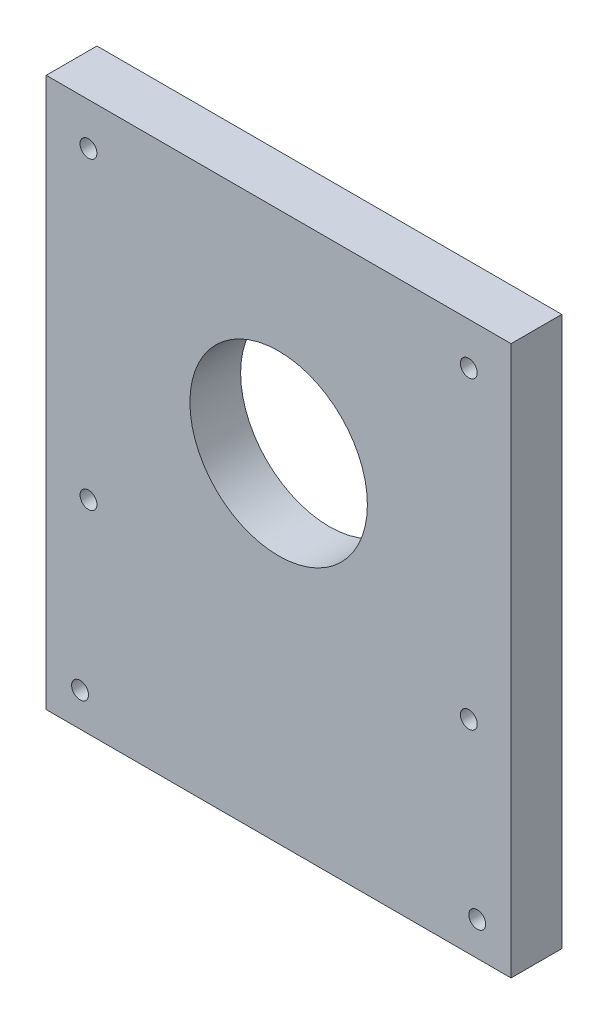
ISO-10303-21;
HEADER;
FILE_DESCRIPTION(('STEP AP214'),'2;1');
FILE_NAME('part.step','',(''),(''),'','','');
FILE_SCHEMA(('AUTOMOTIVE_DESIGN { 1 0 10303 214 1 1 1 1 }'));
ENDSEC;
DATA;
#1=APPLICATION_CONTEXT('core data for automotive mechanical design processes');
#2=APPLICATION_PROTOCOL_DEFINITION('international standard','automotive_design',2000,#1);
#3=PRODUCT_CONTEXT('',#1,'mechanical');
#4=PRODUCT('Part','Part','',(#3));
#5=PRODUCT_RELATED_PRODUCT_CATEGORY('part','',(#4));
#6=PRODUCT_DEFINITION_FORMATION('','',#4);
#7=PRODUCT_DEFINITION_CONTEXT('part definition',#1,'design');
#8=PRODUCT_DEFINITION('design','',#6,#7);
#9=PRODUCT_DEFINITION_SHAPE('','',#8);
#10=(LENGTH_UNIT() NAMED_UNIT(*) SI_UNIT(.MILLI.,.METRE.));
#11=(NAMED_UNIT(*) PLANE_ANGLE_UNIT() SI_UNIT($,.RADIAN.));
#12=(NAMED_UNIT(*) SI_UNIT($,.STERADIAN.) SOLID_ANGLE_UNIT());
#13=UNCERTAINTY_MEASURE_WITH_UNIT(LENGTH_MEASURE(1.E-05),#10,'distance_accuracy_value','');
#14=(GEOMETRIC_REPRESENTATION_CONTEXT(3) GLOBAL_UNCERTAINTY_ASSIGNED_CONTEXT((#13)) GLOBAL_UNIT_ASSIGNED_CONTEXT((#10,
#11,#12)) REPRESENTATION_CONTEXT('',''));
#15=CARTESIAN_POINT('',(0.,0.,0.));
#16=DIRECTION('',(0.,0.,1.));
#17=DIRECTION('',(1.,0.,0.));
#18=AXIS2_PLACEMENT_3D('',#15,#16,#17);
#19=CARTESIAN_POINT('',(55.,-65.,12.));
#20=DIRECTION('',(-1.,0.,0.));
#21=DIRECTION('',(0.,0.,1.));
#22=AXIS2_PLACEMENT_3D('',#19,#20,#21);
#23=PLANE('',#22);
#24=DIRECTION('',(0.,1.,0.));
#25=VECTOR('',#24,1.);
#26=CARTESIAN_POINT('',(55.,-65.,0.));
#27=LINE('',#26,#25);
#28=CARTESIAN_POINT('',(55.,-65.,0.));
#29=VERTEX_POINT('',#28);
#30=CARTESIAN_POINT('',(55.,65.,0.));
#31=VERTEX_POINT('',#30);
#32=EDGE_CURVE('E104',#29,#31,#27,.T.);
#33=ORIENTED_EDGE('',*,*,#32,.T.);
#34=DIRECTION('',(0.,0.,-1.));
#35=VECTOR('',#34,1.);
#36=CARTESIAN_POINT('',(55.,65.,12.));
#37=LINE('',#36,#35);
#38=CARTESIAN_POINT('',(55.,65.,12.));
#39=VERTEX_POINT('',#38);
#40=EDGE_CURVE('E11',#39,#31,#37,.T.);
#41=ORIENTED_EDGE('',*,*,#40,.F.);
#42=DIRECTION('',(0.,1.,0.));
#43=VECTOR('',#42,1.);
#44=CARTESIAN_POINT('',(55.,-65.,12.));
#45=LINE('',#44,#43);
#46=CARTESIAN_POINT('',(55.,-65.,12.));
#47=VERTEX_POINT('',#46);
#48=EDGE_CURVE('E91',#47,#39,#45,.T.);
#49=ORIENTED_EDGE('',*,*,#48,.F.);
#50=DIRECTION('',(0.,0.,-1.));
#51=VECTOR('',#50,1.);
#52=CARTESIAN_POINT('',(55.,-65.,12.));
#53=LINE('',#52,#51);
#54=EDGE_CURVE('E100',#47,#29,#53,.T.);
#55=ORIENTED_EDGE('',*,*,#54,.T.);
#56=EDGE_LOOP('',(#33,#41,#49,#55));
#57=FACE_BOUND('',#56,.T.);
#58=ADVANCED_FACE('F38',(#57),#23,.F.);
#59=CARTESIAN_POINT('',(-55.,65.,12.));
#60=DIRECTION('',(0.,-1.,0.));
#61=DIRECTION('',(0.,0.,-1.));
#62=AXIS2_PLACEMENT_3D('',#59,#60,#61);
#63=PLANE('',#62);
#64=DIRECTION('',(-1.,0.,0.));
#65=VECTOR('',#64,1.);
#66=CARTESIAN_POINT('',(-55.,65.,0.));
#67=LINE('',#66,#65);
#68=CARTESIAN_POINT('',(-55.,65.,0.));
#69=VERTEX_POINT('',#68);
#70=EDGE_CURVE('E95',#31,#69,#67,.T.);
#71=ORIENTED_EDGE('',*,*,#70,.T.);
#72=DIRECTION('',(0.,0.,-1.));
#73=VECTOR('',#72,1.);
#74=CARTESIAN_POINT('',(-55.,65.,12.));
#75=LINE('',#74,#73);
#76=CARTESIAN_POINT('',(-55.,65.,12.));
#77=VERTEX_POINT('',#76);
#78=EDGE_CURVE('E47',#77,#69,#75,.T.);
#79=ORIENTED_EDGE('',*,*,#78,.F.);
#80=DIRECTION('',(-1.,0.,0.));
#81=VECTOR('',#80,1.);
#82=CARTESIAN_POINT('',(-55.,65.,12.));
#83=LINE('',#82,#81);
#84=EDGE_CURVE('E86',#39,#77,#83,.T.);
#85=ORIENTED_EDGE('',*,*,#84,.F.);
#86=ORIENTED_EDGE('',*,*,#40,.T.);
#87=EDGE_LOOP('',(#71,#79,#85,#86));
#88=FACE_BOUND('',#87,.T.);
#89=ADVANCED_FACE('F94',(#88),#63,.F.);
#90=CARTESIAN_POINT('',(-55.,-65.,12.));
#91=DIRECTION('',(1.,0.,0.));
#92=DIRECTION('',(0.,0.,-1.));
#93=AXIS2_PLACEMENT_3D('',#90,#91,#92);
#94=PLANE('',#93);
#95=DIRECTION('',(0.,-1.,0.));
#96=VECTOR('',#95,1.);
#97=CARTESIAN_POINT('',(-55.,-65.,0.));
#98=LINE('',#97,#96);
#99=CARTESIAN_POINT('',(-55.,-65.,0.));
#100=VERTEX_POINT('',#99);
#101=EDGE_CURVE('E73',#69,#100,#98,.T.);
#102=ORIENTED_EDGE('',*,*,#101,.T.);
#103=DIRECTION('',(0.,0.,-1.));
#104=VECTOR('',#103,1.);
#105=CARTESIAN_POINT('',(-55.,-65.,12.));
#106=LINE('',#105,#104);
#107=CARTESIAN_POINT('',(-55.,-65.,12.));
#108=VERTEX_POINT('',#107);
#109=EDGE_CURVE('E96',#108,#100,#106,.T.);
#110=ORIENTED_EDGE('',*,*,#109,.F.);
#111=DIRECTION('',(0.,-1.,0.));
#112=VECTOR('',#111,1.);
#113=CARTESIAN_POINT('',(-55.,-65.,12.));
#114=LINE('',#113,#112);
#115=EDGE_CURVE('E89',#77,#108,#114,.T.);
#116=ORIENTED_EDGE('',*,*,#115,.F.);
#117=ORIENTED_EDGE('',*,*,#78,.T.);
#118=EDGE_LOOP('',(#102,#110,#116,#117));
#119=FACE_BOUND('',#118,.T.);
#120=ADVANCED_FACE('F98',(#119),#94,.F.);
#121=CARTESIAN_POINT('',(-55.,-65.,12.));
#122=DIRECTION('',(0.,1.,0.));
#123=DIRECTION('',(0.,0.,1.));
#124=AXIS2_PLACEMENT_3D('',#121,#122,#123);
#125=PLANE('',#124);
#126=DIRECTION('',(1.,0.,0.));
#127=VECTOR('',#126,1.);
#128=CARTESIAN_POINT('',(-55.,-65.,0.));
#129=LINE('',#128,#127);
#130=EDGE_CURVE('E79',#100,#29,#129,.T.);
#131=ORIENTED_EDGE('',*,*,#130,.T.);
#132=ORIENTED_EDGE('',*,*,#54,.F.);
#133=DIRECTION('',(1.,0.,0.));
#134=VECTOR('',#133,1.);
#135=CARTESIAN_POINT('',(-55.,-65.,12.));
#136=LINE('',#135,#134);
#137=EDGE_CURVE('E56',#108,#47,#136,.T.);
#138=ORIENTED_EDGE('',*,*,#137,.F.);
#139=ORIENTED_EDGE('',*,*,#109,.T.);
#140=EDGE_LOOP('',(#131,#132,#138,#139));
#141=FACE_BOUND('',#140,.T.);
#142=ADVANCED_FACE('F151',(#141),#125,.F.);
#143=CARTESIAN_POINT('',(0.,0.,12.));
#144=DIRECTION('',(0.,0.,-1.));
#145=DIRECTION('',(-1.,0.,0.));
#146=AXIS2_PLACEMENT_3D('',#143,#144,#145);
#147=PLANE('',#146);
#148=CARTESIAN_POINT('',(0.,15.,12.));
#149=DIRECTION('',(0.,0.,1.));
#150=DIRECTION('',(1.,0.,0.));
#151=AXIS2_PLACEMENT_3D('',#148,#149,#150);
#152=CIRCLE('',#151,21.);
#153=CARTESIAN_POINT('',(21.,15.,12.));
#154=VERTEX_POINT('',#153);
#155=EDGE_CURVE('E295',#154,#154,#152,.T.);
#156=ORIENTED_EDGE('',*,*,#155,.F.);
#157=EDGE_LOOP('',(#156));
#158=FACE_BOUND('',#157,.T.);
#159=CARTESIAN_POINT('',(-45.,55.,12.));
#160=DIRECTION('',(0.,0.,-1.));
#161=DIRECTION('',(1.,0.,0.));
#162=AXIS2_PLACEMENT_3D('',#159,#160,#161);
#163=CIRCLE('',#162,2.);
#164=CARTESIAN_POINT('',(-43.,55.,12.));
#165=VERTEX_POINT('',#164);
#166=EDGE_CURVE('E297',#165,#165,#163,.T.);
#167=ORIENTED_EDGE('',*,*,#166,.T.);
#168=EDGE_LOOP('',(#167));
#169=FACE_BOUND('',#168,.T.);
#170=CARTESIAN_POINT('',(-45.,-17.,12.));
#171=DIRECTION('',(0.,0.,-1.));
#172=DIRECTION('',(1.,0.,0.));
#173=AXIS2_PLACEMENT_3D('',#170,#171,#172);
#174=CIRCLE('',#173,2.);
#175=CARTESIAN_POINT('',(-43.,-17.,12.));
#176=VERTEX_POINT('',#175);
#177=EDGE_CURVE('E309',#176,#176,#174,.T.);
#178=ORIENTED_EDGE('',*,*,#177,.T.);
#179=EDGE_LOOP('',(#178));
#180=FACE_BOUND('',#179,.T.);
#181=CARTESIAN_POINT('',(-47.,-57.,12.));
#182=DIRECTION('',(0.,0.,-1.));
#183=DIRECTION('',(1.,0.,0.));
#184=AXIS2_PLACEMENT_3D('',#181,#182,#183);
#185=CIRCLE('',#184,2.);
#186=CARTESIAN_POINT('',(-45.,-57.,12.));
#187=VERTEX_POINT('',#186);
#188=EDGE_CURVE('E306',#187,#187,#185,.T.);
#189=ORIENTED_EDGE('',*,*,#188,.T.);
#190=EDGE_LOOP('',(#189));
#191=FACE_BOUND('',#190,.T.);
#192=CARTESIAN_POINT('',(47.,-57.,12.));
#193=DIRECTION('',(0.,0.,-1.));
#194=DIRECTION('',(-1.,0.,0.));
#195=AXIS2_PLACEMENT_3D('',#192,#193,#194);
#196=CIRCLE('',#195,2.);
#197=CARTESIAN_POINT('',(45.,-57.,12.));
#198=VERTEX_POINT('',#197);
#199=EDGE_CURVE('E303',#198,#198,#196,.T.);
#200=ORIENTED_EDGE('',*,*,#199,.T.);
#201=EDGE_LOOP('',(#200));
#202=FACE_BOUND('',#201,.T.);
#203=CARTESIAN_POINT('',(45.,-17.,12.));
#204=DIRECTION('',(0.,0.,-1.));
#205=DIRECTION('',(-1.,0.,0.));
#206=AXIS2_PLACEMENT_3D('',#203,#204,#205);
#207=CIRCLE('',#206,2.);
#208=CARTESIAN_POINT('',(43.,-17.,12.));
#209=VERTEX_POINT('',#208);
#210=EDGE_CURVE('E300',#209,#209,#207,.T.);
#211=ORIENTED_EDGE('',*,*,#210,.T.);
#212=EDGE_LOOP('',(#211));
#213=FACE_BOUND('',#212,.T.);
#214=CARTESIAN_POINT('',(45.,55.,12.));
#215=DIRECTION('',(0.,0.,-1.));
#216=DIRECTION('',(-1.,0.,0.));
#217=AXIS2_PLACEMENT_3D('',#214,#215,#216);
#218=CIRCLE('',#217,2.);
#219=CARTESIAN_POINT('',(43.,55.,12.));
#220=VERTEX_POINT('',#219);
#221=EDGE_CURVE('E116',#220,#220,#218,.T.);
#222=ORIENTED_EDGE('',*,*,#221,.T.);
#223=EDGE_LOOP('',(#222));
#224=FACE_BOUND('',#223,.T.);
#225=ORIENTED_EDGE('',*,*,#48,.T.);
#226=ORIENTED_EDGE('',*,*,#84,.T.);
#227=ORIENTED_EDGE('',*,*,#115,.T.);
#228=ORIENTED_EDGE('',*,*,#137,.T.);
#229=EDGE_LOOP('',(#225,#226,#227,#228));
#230=FACE_BOUND('',#229,.T.);
#231=ADVANCED_FACE('F87',(#158,#169,#180,#191,#202,#213,#224,#230),#147,.F.);
#232=CARTESIAN_POINT('',(0.,0.,0.));
#233=DIRECTION('',(0.,0.,-1.));
#234=DIRECTION('',(-1.,0.,0.));
#235=AXIS2_PLACEMENT_3D('',#232,#233,#234);
#236=PLANE('',#235);
#237=CARTESIAN_POINT('',(0.,15.,0.));
#238=DIRECTION('',(0.,0.,1.));
#239=DIRECTION('',(1.,0.,0.));
#240=AXIS2_PLACEMENT_3D('',#237,#238,#239);
#241=CIRCLE('',#240,21.);
#242=CARTESIAN_POINT('',(21.,15.,0.));
#243=VERTEX_POINT('',#242);
#244=EDGE_CURVE('E292',#243,#243,#241,.T.);
#245=ORIENTED_EDGE('',*,*,#244,.T.);
#246=EDGE_LOOP('',(#245));
#247=FACE_BOUND('',#246,.T.);
#248=CARTESIAN_POINT('',(-45.,55.,0.));
#249=DIRECTION('',(0.,0.,-1.));
#250=DIRECTION('',(-1.,0.,0.));
#251=AXIS2_PLACEMENT_3D('',#248,#249,#250);
#252=CIRCLE('',#251,2.);
#253=CARTESIAN_POINT('',(-47.,55.,0.));
#254=VERTEX_POINT('',#253);
#255=EDGE_CURVE('E41',#254,#254,#252,.T.);
#256=ORIENTED_EDGE('',*,*,#255,.F.);
#257=EDGE_LOOP('',(#256));
#258=FACE_BOUND('',#257,.T.);
#259=CARTESIAN_POINT('',(-45.,-17.,0.));
#260=DIRECTION('',(0.,0.,-1.));
#261=DIRECTION('',(-1.,0.,0.));
#262=AXIS2_PLACEMENT_3D('',#259,#260,#261);
#263=CIRCLE('',#262,2.);
#264=CARTESIAN_POINT('',(-47.,-17.,0.));
#265=VERTEX_POINT('',#264);
#266=EDGE_CURVE('E124',#265,#265,#263,.T.);
#267=ORIENTED_EDGE('',*,*,#266,.F.);
#268=EDGE_LOOP('',(#267));
#269=FACE_BOUND('',#268,.T.);
#270=CARTESIAN_POINT('',(-47.,-57.,0.));
#271=DIRECTION('',(0.,0.,-1.));
#272=DIRECTION('',(-1.,0.,0.));
#273=AXIS2_PLACEMENT_3D('',#270,#271,#272);
#274=CIRCLE('',#273,2.);
#275=CARTESIAN_POINT('',(-49.,-57.,0.));
#276=VERTEX_POINT('',#275);
#277=EDGE_CURVE('E122',#276,#276,#274,.T.);
#278=ORIENTED_EDGE('',*,*,#277,.F.);
#279=EDGE_LOOP('',(#278));
#280=FACE_BOUND('',#279,.T.);
#281=CARTESIAN_POINT('',(47.,-57.,0.));
#282=DIRECTION('',(0.,0.,-1.));
#283=DIRECTION('',(-1.,0.,0.));
#284=AXIS2_PLACEMENT_3D('',#281,#282,#283);
#285=CIRCLE('',#284,2.);
#286=CARTESIAN_POINT('',(45.,-57.,0.));
#287=VERTEX_POINT('',#286);
#288=EDGE_CURVE('E119',#287,#287,#285,.T.);
#289=ORIENTED_EDGE('',*,*,#288,.F.);
#290=EDGE_LOOP('',(#289));
#291=FACE_BOUND('',#290,.T.);
#292=CARTESIAN_POINT('',(45.,-17.,0.));
#293=DIRECTION('',(0.,0.,-1.));
#294=DIRECTION('',(-1.,0.,0.));
#295=AXIS2_PLACEMENT_3D('',#292,#293,#294);
#296=CIRCLE('',#295,2.);
#297=CARTESIAN_POINT('',(43.,-17.,0.));
#298=VERTEX_POINT('',#297);
#299=EDGE_CURVE('E115',#298,#298,#296,.T.);
#300=ORIENTED_EDGE('',*,*,#299,.F.);
#301=EDGE_LOOP('',(#300));
#302=FACE_BOUND('',#301,.T.);
#303=CARTESIAN_POINT('',(45.,55.,0.));
#304=DIRECTION('',(0.,0.,-1.));
#305=DIRECTION('',(-1.,0.,0.));
#306=AXIS2_PLACEMENT_3D('',#303,#304,#305);
#307=CIRCLE('',#306,2.);
#308=CARTESIAN_POINT('',(43.,55.,0.));
#309=VERTEX_POINT('',#308);
#310=EDGE_CURVE('E112',#309,#309,#307,.T.);
#311=ORIENTED_EDGE('',*,*,#310,.F.);
#312=EDGE_LOOP('',(#311));
#313=FACE_BOUND('',#312,.T.);
#314=ORIENTED_EDGE('',*,*,#32,.F.);
#315=ORIENTED_EDGE('',*,*,#130,.F.);
#316=ORIENTED_EDGE('',*,*,#101,.F.);
#317=ORIENTED_EDGE('',*,*,#70,.F.);
#318=EDGE_LOOP('',(#314,#315,#316,#317));
#319=FACE_BOUND('',#318,.T.);
#320=ADVANCED_FACE('F134',(#247,#258,#269,#280,#291,#302,#313,#319),#236,.T.);
#321=CARTESIAN_POINT('',(45.,55.,12.));
#322=DIRECTION('',(0.,0.,-1.));
#323=DIRECTION('',(-1.,0.,0.));
#324=AXIS2_PLACEMENT_3D('',#321,#322,#323);
#325=CYLINDRICAL_SURFACE('',#324,2.);
#326=ORIENTED_EDGE('',*,*,#310,.T.);
#327=EDGE_LOOP('',(#326));
#328=FACE_BOUND('',#327,.T.);
#329=ORIENTED_EDGE('',*,*,#221,.F.);
#330=EDGE_LOOP('',(#329));
#331=FACE_BOUND('',#330,.T.);
#332=ADVANCED_FACE('F137',(#328,#331),#325,.F.);
#333=CARTESIAN_POINT('',(45.,-17.,12.));
#334=DIRECTION('',(0.,0.,-1.));
#335=DIRECTION('',(-1.,0.,0.));
#336=AXIS2_PLACEMENT_3D('',#333,#334,#335);
#337=CYLINDRICAL_SURFACE('',#336,2.);
#338=ORIENTED_EDGE('',*,*,#299,.T.);
#339=EDGE_LOOP('',(#338));
#340=FACE_BOUND('',#339,.T.);
#341=ORIENTED_EDGE('',*,*,#210,.F.);
#342=EDGE_LOOP('',(#341));
#343=FACE_BOUND('',#342,.T.);
#344=ADVANCED_FACE('F187',(#340,#343),#337,.F.);
#345=CARTESIAN_POINT('',(47.,-57.,12.));
#346=DIRECTION('',(0.,0.,-1.));
#347=DIRECTION('',(-1.,0.,0.));
#348=AXIS2_PLACEMENT_3D('',#345,#346,#347);
#349=CYLINDRICAL_SURFACE('',#348,2.);
#350=ORIENTED_EDGE('',*,*,#288,.T.);
#351=EDGE_LOOP('',(#350));
#352=FACE_BOUND('',#351,.T.);
#353=ORIENTED_EDGE('',*,*,#199,.F.);
#354=EDGE_LOOP('',(#353));
#355=FACE_BOUND('',#354,.T.);
#356=ADVANCED_FACE('F199',(#352,#355),#349,.F.);
#357=CARTESIAN_POINT('',(-47.,-57.,12.));
#358=DIRECTION('',(0.,0.,-1.));
#359=DIRECTION('',(-1.,0.,0.));
#360=AXIS2_PLACEMENT_3D('',#357,#358,#359);
#361=CYLINDRICAL_SURFACE('',#360,2.);
#362=ORIENTED_EDGE('',*,*,#277,.T.);
#363=EDGE_LOOP('',(#362));
#364=FACE_BOUND('',#363,.T.);
#365=ORIENTED_EDGE('',*,*,#188,.F.);
#366=EDGE_LOOP('',(#365));
#367=FACE_BOUND('',#366,.T.);
#368=ADVANCED_FACE('F210',(#364,#367),#361,.F.);
#369=CARTESIAN_POINT('',(-45.,-17.,12.));
#370=DIRECTION('',(0.,0.,-1.));
#371=DIRECTION('',(-1.,0.,0.));
#372=AXIS2_PLACEMENT_3D('',#369,#370,#371);
#373=CYLINDRICAL_SURFACE('',#372,2.);
#374=ORIENTED_EDGE('',*,*,#266,.T.);
#375=EDGE_LOOP('',(#374));
#376=FACE_BOUND('',#375,.T.);
#377=ORIENTED_EDGE('',*,*,#177,.F.);
#378=EDGE_LOOP('',(#377));
#379=FACE_BOUND('',#378,.T.);
#380=ADVANCED_FACE('F221',(#376,#379),#373,.F.);
#381=CARTESIAN_POINT('',(-45.,55.,12.));
#382=DIRECTION('',(0.,0.,-1.));
#383=DIRECTION('',(-1.,0.,0.));
#384=AXIS2_PLACEMENT_3D('',#381,#382,#383);
#385=CYLINDRICAL_SURFACE('',#384,2.);
#386=ORIENTED_EDGE('',*,*,#255,.T.);
#387=EDGE_LOOP('',(#386));
#388=FACE_BOUND('',#387,.T.);
#389=ORIENTED_EDGE('',*,*,#166,.F.);
#390=EDGE_LOOP('',(#389));
#391=FACE_BOUND('',#390,.T.);
#392=ADVANCED_FACE('F131',(#388,#391),#385,.F.);
#393=CARTESIAN_POINT('',(0.,15.,0.));
#394=DIRECTION('',(0.,0.,1.));
#395=DIRECTION('',(1.,0.,0.));
#396=AXIS2_PLACEMENT_3D('',#393,#394,#395);
#397=CYLINDRICAL_SURFACE('',#396,21.);
#398=ORIENTED_EDGE('',*,*,#244,.F.);
#399=EDGE_LOOP('',(#398));
#400=FACE_BOUND('',#399,.T.);
#401=ORIENTED_EDGE('',*,*,#155,.T.);
#402=EDGE_LOOP('',(#401));
#403=FACE_BOUND('',#402,.T.);
#404=ADVANCED_FACE('F241',(#400,#403),#397,.F.);
#405=CLOSED_SHELL('',(#58,#89,#120,#142,#231,#320,#332,#344,#356,#368,#380,#392,#404));
#406=MANIFOLD_SOLID_BREP('B2',#405);
#407=ADVANCED_BREP_SHAPE_REPRESENTATION('',(#18,#406),#14);
#408=SHAPE_DEFINITION_REPRESENTATION(#9,#407);
ENDSEC;
END-ISO-10303-21;
